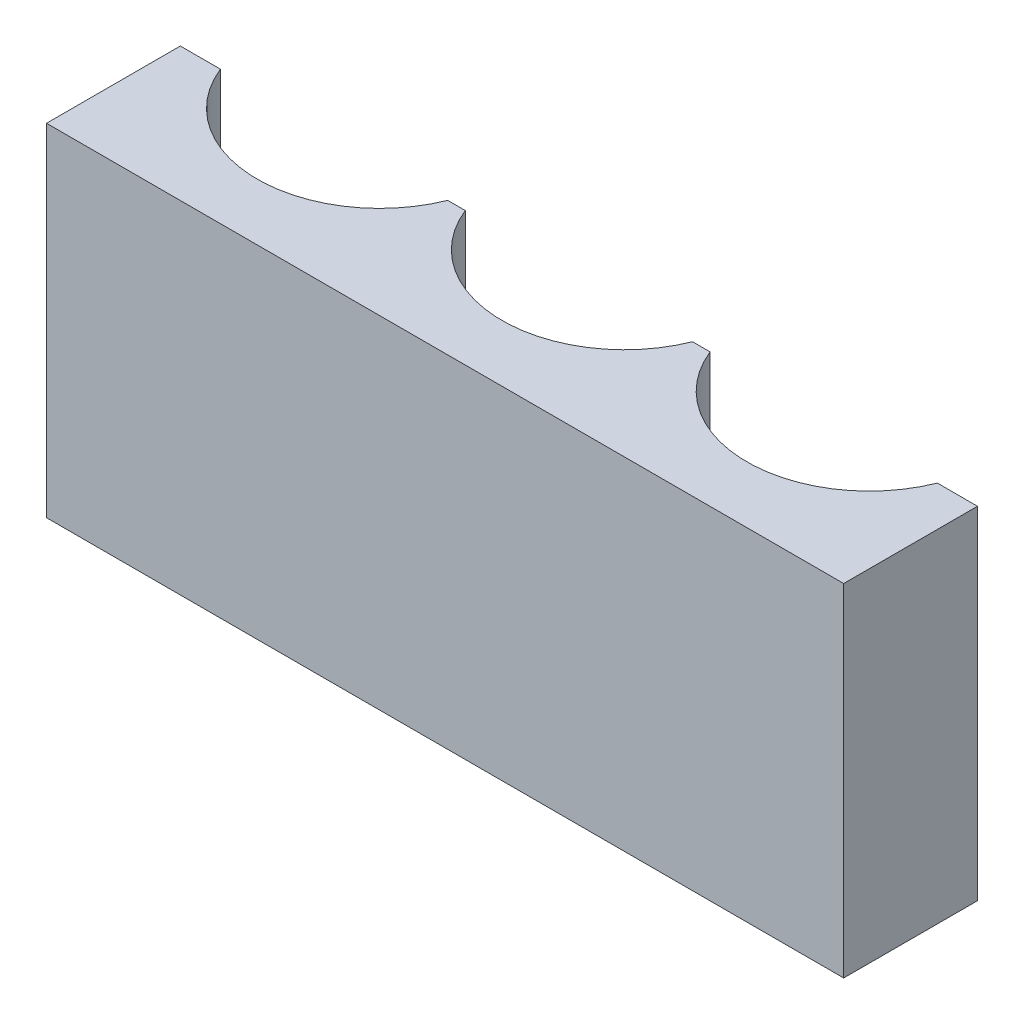
ISO-10303-21;
HEADER;
FILE_DESCRIPTION(('STEP AP214'),'2;1');
FILE_NAME('part.step','',(''),(''),'','','');
FILE_SCHEMA(('AUTOMOTIVE_DESIGN { 1 0 10303 214 1 1 1 1 }'));
ENDSEC;
DATA;
#1=APPLICATION_CONTEXT('core data for automotive mechanical design processes');
#2=APPLICATION_PROTOCOL_DEFINITION('international standard','automotive_design',2000,#1);
#3=PRODUCT_CONTEXT('',#1,'mechanical');
#4=PRODUCT('Part','Part','',(#3));
#5=PRODUCT_RELATED_PRODUCT_CATEGORY('part','',(#4));
#6=PRODUCT_DEFINITION_FORMATION('','',#4);
#7=PRODUCT_DEFINITION_CONTEXT('part definition',#1,'design');
#8=PRODUCT_DEFINITION('design','',#6,#7);
#9=PRODUCT_DEFINITION_SHAPE('','',#8);
#10=(LENGTH_UNIT() NAMED_UNIT(*) SI_UNIT(.MILLI.,.METRE.));
#11=(NAMED_UNIT(*) PLANE_ANGLE_UNIT() SI_UNIT($,.RADIAN.));
#12=(NAMED_UNIT(*) SI_UNIT($,.STERADIAN.) SOLID_ANGLE_UNIT());
#13=UNCERTAINTY_MEASURE_WITH_UNIT(LENGTH_MEASURE(1.E-05),#10,'distance_accuracy_value','');
#14=(GEOMETRIC_REPRESENTATION_CONTEXT(3) GLOBAL_UNCERTAINTY_ASSIGNED_CONTEXT((#13)) GLOBAL_UNIT_ASSIGNED_CONTEXT((#10,
#11,#12)) REPRESENTATION_CONTEXT('',''));
#15=CARTESIAN_POINT('',(0.,0.,0.));
#16=DIRECTION('',(0.,0.,1.));
#17=DIRECTION('',(1.,0.,0.));
#18=AXIS2_PLACEMENT_3D('',#15,#16,#17);
#19=CARTESIAN_POINT('',(-35.,15.,15.75));
#20=DIRECTION('',(0.,-1.,0.));
#21=DIRECTION('',(0.,0.,-1.));
#22=AXIS2_PLACEMENT_3D('',#19,#20,#21);
#23=PLANE('',#22);
#24=DIRECTION('',(0.,0.,-1.));
#25=VECTOR('',#24,1.);
#26=CARTESIAN_POINT('',(35.,15.,15.75));
#27=LINE('',#26,#25);
#28=CARTESIAN_POINT('',(35.,15.,15.75));
#29=VERTEX_POINT('',#28);
#30=CARTESIAN_POINT('',(35.,15.,4.));
#31=VERTEX_POINT('',#30);
#32=EDGE_CURVE('E346',#29,#31,#27,.T.);
#33=ORIENTED_EDGE('',*,*,#32,.T.);
#34=DIRECTION('',(1.,0.,0.));
#35=VECTOR('',#34,1.);
#36=CARTESIAN_POINT('',(-35.,15.,4.));
#37=LINE('',#36,#35);
#38=CARTESIAN_POINT('',(31.4781010217376,15.,4.));
#39=VERTEX_POINT('',#38);
#40=EDGE_CURVE('E243',#39,#31,#37,.T.);
#41=ORIENTED_EDGE('',*,*,#40,.F.);
#42=CARTESIAN_POINT('',(21.5,15.,0.));
#43=DIRECTION('',(0.,1.,0.));
#44=DIRECTION('',(0.,0.,1.));
#45=AXIS2_PLACEMENT_3D('',#42,#43,#44);
#46=CIRCLE('',#45,10.75);
#47=CARTESIAN_POINT('',(11.5218989782624,15.,4.));
#48=VERTEX_POINT('',#47);
#49=EDGE_CURVE('E314',#39,#48,#46,.F.);
#50=ORIENTED_EDGE('',*,*,#49,.T.);
#51=CARTESIAN_POINT('',(9.97810102173755,15.,4.));
#52=VERTEX_POINT('',#51);
#53=EDGE_CURVE('E453',#52,#48,#37,.T.);
#54=ORIENTED_EDGE('',*,*,#53,.F.);
#55=CARTESIAN_POINT('',(0.,15.,0.));
#56=DIRECTION('',(0.,1.,0.));
#57=DIRECTION('',(0.,0.,1.));
#58=AXIS2_PLACEMENT_3D('',#55,#56,#57);
#59=CIRCLE('',#58,10.75);
#60=CARTESIAN_POINT('',(-9.97810102173755,15.,4.));
#61=VERTEX_POINT('',#60);
#62=EDGE_CURVE('E310',#52,#61,#59,.F.);
#63=ORIENTED_EDGE('',*,*,#62,.T.);
#64=CARTESIAN_POINT('',(-11.5218989782624,15.,4.));
#65=VERTEX_POINT('',#64);
#66=EDGE_CURVE('E297',#65,#61,#37,.T.);
#67=ORIENTED_EDGE('',*,*,#66,.F.);
#68=CARTESIAN_POINT('',(-21.5,15.,1.50133697570255E-13));
#69=DIRECTION('',(0.,1.,0.));
#70=DIRECTION('',(0.,0.,1.));
#71=AXIS2_PLACEMENT_3D('',#68,#69,#70);
#72=CIRCLE('',#71,10.75);
#73=CARTESIAN_POINT('',(-31.4781010217376,15.,4.));
#74=VERTEX_POINT('',#73);
#75=EDGE_CURVE('E321',#65,#74,#72,.F.);
#76=ORIENTED_EDGE('',*,*,#75,.T.);
#77=CARTESIAN_POINT('',(-35.,15.,4.));
#78=VERTEX_POINT('',#77);
#79=EDGE_CURVE('E295',#78,#74,#37,.T.);
#80=ORIENTED_EDGE('',*,*,#79,.F.);
#81=DIRECTION('',(0.,0.,-1.));
#82=VECTOR('',#81,1.);
#83=CARTESIAN_POINT('',(-35.,15.,15.75));
#84=LINE('',#83,#82);
#85=CARTESIAN_POINT('',(-35.,15.,15.75));
#86=VERTEX_POINT('',#85);
#87=EDGE_CURVE('E343',#86,#78,#84,.T.);
#88=ORIENTED_EDGE('',*,*,#87,.F.);
#89=DIRECTION('',(-1.,0.,0.));
#90=VECTOR('',#89,1.);
#91=CARTESIAN_POINT('',(-35.,15.,15.75));
#92=LINE('',#91,#90);
#93=EDGE_CURVE('E331',#29,#86,#92,.T.);
#94=ORIENTED_EDGE('',*,*,#93,.F.);
#95=EDGE_LOOP('',(#33,#41,#50,#54,#63,#67,#76,#80,#88,#94));
#96=FACE_BOUND('',#95,.T.);
#97=ADVANCED_FACE('F64',(#96),#23,.F.);
#98=CARTESIAN_POINT('',(-35.,-15.,15.75));
#99=DIRECTION('',(0.,1.,0.));
#100=DIRECTION('',(0.,0.,1.));
#101=AXIS2_PLACEMENT_3D('',#98,#99,#100);
#102=PLANE('',#101);
#103=DIRECTION('',(0.,0.,-1.));
#104=VECTOR('',#103,1.);
#105=CARTESIAN_POINT('',(-35.,-15.,15.75));
#106=LINE('',#105,#104);
#107=CARTESIAN_POINT('',(-35.,-15.,15.75));
#108=VERTEX_POINT('',#107);
#109=CARTESIAN_POINT('',(-35.,-15.,4.));
#110=VERTEX_POINT('',#109);
#111=EDGE_CURVE('E340',#108,#110,#106,.T.);
#112=ORIENTED_EDGE('',*,*,#111,.T.);
#113=DIRECTION('',(1.,0.,0.));
#114=VECTOR('',#113,1.);
#115=CARTESIAN_POINT('',(-35.,-15.,4.));
#116=LINE('',#115,#114);
#117=CARTESIAN_POINT('',(-31.4781010217376,-15.,4.));
#118=VERTEX_POINT('',#117);
#119=EDGE_CURVE('E289',#110,#118,#116,.T.);
#120=ORIENTED_EDGE('',*,*,#119,.T.);
#121=CARTESIAN_POINT('',(-21.5,-15.,1.50133697570255E-13));
#122=DIRECTION('',(0.,1.,0.));
#123=DIRECTION('',(0.,0.,1.));
#124=AXIS2_PLACEMENT_3D('',#121,#122,#123);
#125=CIRCLE('',#124,10.75);
#126=CARTESIAN_POINT('',(-11.5218989782624,-15.,4.));
#127=VERTEX_POINT('',#126);
#128=EDGE_CURVE('E317',#127,#118,#125,.F.);
#129=ORIENTED_EDGE('',*,*,#128,.F.);
#130=CARTESIAN_POINT('',(-9.97810102173755,-15.,4.));
#131=VERTEX_POINT('',#130);
#132=EDGE_CURVE('E293',#127,#131,#116,.T.);
#133=ORIENTED_EDGE('',*,*,#132,.T.);
#134=CARTESIAN_POINT('',(0.,-15.,0.));
#135=DIRECTION('',(0.,1.,0.));
#136=DIRECTION('',(0.,0.,1.));
#137=AXIS2_PLACEMENT_3D('',#134,#135,#136);
#138=CIRCLE('',#137,10.75);
#139=CARTESIAN_POINT('',(9.97810102173755,-15.,4.));
#140=VERTEX_POINT('',#139);
#141=EDGE_CURVE('E311',#140,#131,#138,.F.);
#142=ORIENTED_EDGE('',*,*,#141,.F.);
#143=CARTESIAN_POINT('',(11.5218989782624,-15.,4.));
#144=VERTEX_POINT('',#143);
#145=EDGE_CURVE('E467',#140,#144,#116,.T.);
#146=ORIENTED_EDGE('',*,*,#145,.T.);
#147=CARTESIAN_POINT('',(21.5,-15.,0.));
#148=DIRECTION('',(0.,1.,0.));
#149=DIRECTION('',(0.,0.,1.));
#150=AXIS2_PLACEMENT_3D('',#147,#148,#149);
#151=CIRCLE('',#150,10.75);
#152=CARTESIAN_POINT('',(31.4781010217376,-15.,4.));
#153=VERTEX_POINT('',#152);
#154=EDGE_CURVE('E324',#153,#144,#151,.F.);
#155=ORIENTED_EDGE('',*,*,#154,.F.);
#156=CARTESIAN_POINT('',(35.,-15.,4.));
#157=VERTEX_POINT('',#156);
#158=EDGE_CURVE('E294',#153,#157,#116,.T.);
#159=ORIENTED_EDGE('',*,*,#158,.T.);
#160=DIRECTION('',(0.,0.,-1.));
#161=VECTOR('',#160,1.);
#162=CARTESIAN_POINT('',(35.,-15.,15.75));
#163=LINE('',#162,#161);
#164=CARTESIAN_POINT('',(35.,-15.,15.75));
#165=VERTEX_POINT('',#164);
#166=EDGE_CURVE('E337',#165,#157,#163,.T.);
#167=ORIENTED_EDGE('',*,*,#166,.F.);
#168=DIRECTION('',(1.,0.,0.));
#169=VECTOR('',#168,1.);
#170=CARTESIAN_POINT('',(-35.,-15.,15.75));
#171=LINE('',#170,#169);
#172=EDGE_CURVE('E335',#108,#165,#171,.T.);
#173=ORIENTED_EDGE('',*,*,#172,.F.);
#174=EDGE_LOOP('',(#112,#120,#129,#133,#142,#146,#155,#159,#167,#173));
#175=FACE_BOUND('',#174,.T.);
#176=ADVANCED_FACE('F400',(#175),#102,.F.);
#177=CARTESIAN_POINT('',(35.,15.,15.75));
#178=DIRECTION('',(-1.,0.,0.));
#179=DIRECTION('',(0.,0.,1.));
#180=AXIS2_PLACEMENT_3D('',#177,#178,#179);
#181=PLANE('',#180);
#182=ORIENTED_EDGE('',*,*,#166,.T.);
#183=DIRECTION('',(0.,1.,0.));
#184=VECTOR('',#183,1.);
#185=CARTESIAN_POINT('',(35.,-15.,4.));
#186=LINE('',#185,#184);
#187=EDGE_CURVE('E298',#157,#31,#186,.T.);
#188=ORIENTED_EDGE('',*,*,#187,.T.);
#189=ORIENTED_EDGE('',*,*,#32,.F.);
#190=DIRECTION('',(0.,1.,0.));
#191=VECTOR('',#190,1.);
#192=CARTESIAN_POINT('',(35.,15.,15.75));
#193=LINE('',#192,#191);
#194=EDGE_CURVE('E320',#165,#29,#193,.T.);
#195=ORIENTED_EDGE('',*,*,#194,.F.);
#196=EDGE_LOOP('',(#182,#188,#189,#195));
#197=FACE_BOUND('',#196,.T.);
#198=ADVANCED_FACE('F66',(#197),#181,.F.);
#199=CARTESIAN_POINT('',(-35.,15.,15.75));
#200=DIRECTION('',(1.,0.,0.));
#201=DIRECTION('',(0.,0.,-1.));
#202=AXIS2_PLACEMENT_3D('',#199,#200,#201);
#203=PLANE('',#202);
#204=ORIENTED_EDGE('',*,*,#87,.T.);
#205=DIRECTION('',(0.,1.,0.));
#206=VECTOR('',#205,1.);
#207=CARTESIAN_POINT('',(-35.,-15.,4.));
#208=LINE('',#207,#206);
#209=EDGE_CURVE('E292',#110,#78,#208,.T.);
#210=ORIENTED_EDGE('',*,*,#209,.F.);
#211=ORIENTED_EDGE('',*,*,#111,.F.);
#212=DIRECTION('',(0.,-1.,0.));
#213=VECTOR('',#212,1.);
#214=CARTESIAN_POINT('',(-35.,15.,15.75));
#215=LINE('',#214,#213);
#216=EDGE_CURVE('E333',#86,#108,#215,.T.);
#217=ORIENTED_EDGE('',*,*,#216,.F.);
#218=EDGE_LOOP('',(#204,#210,#211,#217));
#219=FACE_BOUND('',#218,.T.);
#220=ADVANCED_FACE('F408',(#219),#203,.F.);
#221=CARTESIAN_POINT('',(0.,0.,15.75));
#222=DIRECTION('',(0.,0.,1.));
#223=DIRECTION('',(1.,0.,0.));
#224=AXIS2_PLACEMENT_3D('',#221,#222,#223);
#225=PLANE('',#224);
#226=ORIENTED_EDGE('',*,*,#194,.T.);
#227=ORIENTED_EDGE('',*,*,#93,.T.);
#228=ORIENTED_EDGE('',*,*,#216,.T.);
#229=ORIENTED_EDGE('',*,*,#172,.T.);
#230=EDGE_LOOP('',(#226,#227,#228,#229));
#231=FACE_BOUND('',#230,.T.);
#232=ADVANCED_FACE('F410',(#231),#225,.T.);
#233=CARTESIAN_POINT('',(21.5,-15.,0.));
#234=DIRECTION('',(0.,1.,0.));
#235=DIRECTION('',(0.,0.,1.));
#236=AXIS2_PLACEMENT_3D('',#233,#234,#235);
#237=CYLINDRICAL_SURFACE('',#236,10.75);
#238=CARTESIAN_POINT('',(21.5,-5.00000000000015,0.));
#239=DIRECTION('',(0.,-1.,0.));
#240=DIRECTION('',(0.,0.,-1.));
#241=AXIS2_PLACEMENT_3D('',#238,#239,#240);
#242=CIRCLE('',#241,10.75);
#243=CARTESIAN_POINT('',(24.,-5.00000000000015,10.4552618331632));
#244=VERTEX_POINT('',#243);
#245=CARTESIAN_POINT('',(19.,-5.00000000000015,10.4552618331632));
#246=VERTEX_POINT('',#245);
#247=EDGE_CURVE('E12',#244,#246,#242,.T.);
#248=ORIENTED_EDGE('',*,*,#247,.F.);
#249=DIRECTION('',(0.,1.,0.));
#250=VECTOR('',#249,1.);
#251=CARTESIAN_POINT('',(24.,-15.,10.4552618331632));
#252=LINE('',#251,#250);
#253=CARTESIAN_POINT('',(24.,4.99999999999985,10.4552618331632));
#254=VERTEX_POINT('',#253);
#255=EDGE_CURVE('E72',#254,#244,#252,.F.);
#256=ORIENTED_EDGE('',*,*,#255,.F.);
#257=CARTESIAN_POINT('',(21.5,4.99999999999985,0.));
#258=DIRECTION('',(0.,1.,0.));
#259=DIRECTION('',(0.,0.,1.));
#260=AXIS2_PLACEMENT_3D('',#257,#258,#259);
#261=CIRCLE('',#260,10.75);
#262=CARTESIAN_POINT('',(19.,4.99999999999985,10.4552618331632));
#263=VERTEX_POINT('',#262);
#264=EDGE_CURVE('E371',#263,#254,#261,.T.);
#265=ORIENTED_EDGE('',*,*,#264,.F.);
#266=DIRECTION('',(0.,1.,0.));
#267=VECTOR('',#266,1.);
#268=CARTESIAN_POINT('',(19.,-15.,10.4552618331632));
#269=LINE('',#268,#267);
#270=EDGE_CURVE('E369',#246,#263,#269,.T.);
#271=ORIENTED_EDGE('',*,*,#270,.F.);
#272=EDGE_LOOP('',(#248,#256,#265,#271));
#273=FACE_BOUND('',#272,.T.);
#274=DIRECTION('',(0.,1.,0.));
#275=VECTOR('',#274,1.);
#276=CARTESIAN_POINT('',(31.4781010217376,-15.,4.));
#277=LINE('',#276,#275);
#278=EDGE_CURVE('E308',#153,#39,#277,.T.);
#279=ORIENTED_EDGE('',*,*,#278,.F.);
#280=ORIENTED_EDGE('',*,*,#154,.T.);
#281=DIRECTION('',(0.,1.,0.));
#282=VECTOR('',#281,1.);
#283=CARTESIAN_POINT('',(11.5218989782624,-15.,4.));
#284=LINE('',#283,#282);
#285=EDGE_CURVE('E306',#48,#144,#284,.F.);
#286=ORIENTED_EDGE('',*,*,#285,.F.);
#287=ORIENTED_EDGE('',*,*,#49,.F.);
#288=EDGE_LOOP('',(#279,#280,#286,#287));
#289=FACE_BOUND('',#288,.T.);
#290=ADVANCED_FACE('F383',(#273,#289),#237,.F.);
#291=CARTESIAN_POINT('',(-21.5,-15.,1.50133697570255E-13));
#292=DIRECTION('',(0.,1.,0.));
#293=DIRECTION('',(0.,0.,1.));
#294=AXIS2_PLACEMENT_3D('',#291,#292,#293);
#295=CYLINDRICAL_SURFACE('',#294,10.75);
#296=CARTESIAN_POINT('',(-21.5,-5.,1.50133697570255E-13));
#297=DIRECTION('',(0.,-1.,0.));
#298=DIRECTION('',(0.,0.,-1.));
#299=AXIS2_PLACEMENT_3D('',#296,#297,#298);
#300=CIRCLE('',#299,10.75);
#301=CARTESIAN_POINT('',(-19.,-5.,10.4552618331634));
#302=VERTEX_POINT('',#301);
#303=CARTESIAN_POINT('',(-24.,-5.,10.4552618331634));
#304=VERTEX_POINT('',#303);
#305=EDGE_CURVE('E217',#302,#304,#300,.T.);
#306=ORIENTED_EDGE('',*,*,#305,.F.);
#307=DIRECTION('',(0.,1.,0.));
#308=VECTOR('',#307,1.);
#309=CARTESIAN_POINT('',(-19.,-15.,10.4552618331634));
#310=LINE('',#309,#308);
#311=CARTESIAN_POINT('',(-19.,5.,10.4552618331634));
#312=VERTEX_POINT('',#311);
#313=EDGE_CURVE('E366',#312,#302,#310,.F.);
#314=ORIENTED_EDGE('',*,*,#313,.F.);
#315=CARTESIAN_POINT('',(-21.5,5.,1.50133697570255E-13));
#316=DIRECTION('',(0.,1.,0.));
#317=DIRECTION('',(0.,0.,1.));
#318=AXIS2_PLACEMENT_3D('',#315,#316,#317);
#319=CIRCLE('',#318,10.75);
#320=CARTESIAN_POINT('',(-24.,5.,10.4552618331634));
#321=VERTEX_POINT('',#320);
#322=EDGE_CURVE('E364',#321,#312,#319,.T.);
#323=ORIENTED_EDGE('',*,*,#322,.F.);
#324=DIRECTION('',(0.,1.,0.));
#325=VECTOR('',#324,1.);
#326=CARTESIAN_POINT('',(-24.,-15.,10.4552618331634));
#327=LINE('',#326,#325);
#328=EDGE_CURVE('E362',#304,#321,#327,.T.);
#329=ORIENTED_EDGE('',*,*,#328,.F.);
#330=EDGE_LOOP('',(#306,#314,#323,#329));
#331=FACE_BOUND('',#330,.T.);
#332=DIRECTION('',(0.,1.,0.));
#333=VECTOR('',#332,1.);
#334=CARTESIAN_POINT('',(-11.5218989782624,-15.,4.));
#335=LINE('',#334,#333);
#336=EDGE_CURVE('E304',#127,#65,#335,.T.);
#337=ORIENTED_EDGE('',*,*,#336,.F.);
#338=ORIENTED_EDGE('',*,*,#128,.T.);
#339=DIRECTION('',(0.,1.,0.));
#340=VECTOR('',#339,1.);
#341=CARTESIAN_POINT('',(-31.4781010217376,-15.,4.));
#342=LINE('',#341,#340);
#343=EDGE_CURVE('E301',#74,#118,#342,.F.);
#344=ORIENTED_EDGE('',*,*,#343,.F.);
#345=ORIENTED_EDGE('',*,*,#75,.F.);
#346=EDGE_LOOP('',(#337,#338,#344,#345));
#347=FACE_BOUND('',#346,.T.);
#348=ADVANCED_FACE('F418',(#331,#347),#295,.F.);
#349=CARTESIAN_POINT('',(0.,-15.,0.));
#350=DIRECTION('',(0.,1.,0.));
#351=DIRECTION('',(0.,0.,1.));
#352=AXIS2_PLACEMENT_3D('',#349,#350,#351);
#353=CYLINDRICAL_SURFACE('',#352,10.75);
#354=DIRECTION('',(0.,1.,0.));
#355=VECTOR('',#354,1.);
#356=CARTESIAN_POINT('',(-2.5,-15.,10.4552618331632));
#357=LINE('',#356,#355);
#358=CARTESIAN_POINT('',(-2.5,-5.,10.4552618331632));
#359=VERTEX_POINT('',#358);
#360=CARTESIAN_POINT('',(-2.5,5.,10.4552618331632));
#361=VERTEX_POINT('',#360);
#362=EDGE_CURVE('E359',#359,#361,#357,.T.);
#363=ORIENTED_EDGE('',*,*,#362,.F.);
#364=CARTESIAN_POINT('',(0.,-5.,0.));
#365=DIRECTION('',(0.,-1.,0.));
#366=DIRECTION('',(0.,0.,-1.));
#367=AXIS2_PLACEMENT_3D('',#364,#365,#366);
#368=CIRCLE('',#367,10.75);
#369=CARTESIAN_POINT('',(2.5,-5.,10.4552618331632));
#370=VERTEX_POINT('',#369);
#371=EDGE_CURVE('E357',#370,#359,#368,.T.);
#372=ORIENTED_EDGE('',*,*,#371,.F.);
#373=DIRECTION('',(0.,1.,0.));
#374=VECTOR('',#373,1.);
#375=CARTESIAN_POINT('',(2.5,-15.,10.4552618331632));
#376=LINE('',#375,#374);
#377=CARTESIAN_POINT('',(2.5,5.,10.4552618331632));
#378=VERTEX_POINT('',#377);
#379=EDGE_CURVE('E355',#378,#370,#376,.F.);
#380=ORIENTED_EDGE('',*,*,#379,.F.);
#381=CARTESIAN_POINT('',(0.,5.,0.));
#382=DIRECTION('',(0.,1.,0.));
#383=DIRECTION('',(0.,0.,1.));
#384=AXIS2_PLACEMENT_3D('',#381,#382,#383);
#385=CIRCLE('',#384,10.75);
#386=EDGE_CURVE('E353',#361,#378,#385,.T.);
#387=ORIENTED_EDGE('',*,*,#386,.F.);
#388=EDGE_LOOP('',(#363,#372,#380,#387));
#389=FACE_BOUND('',#388,.T.);
#390=DIRECTION('',(0.,1.,0.));
#391=VECTOR('',#390,1.);
#392=CARTESIAN_POINT('',(9.97810102173755,-15.,4.));
#393=LINE('',#392,#391);
#394=EDGE_CURVE('E351',#140,#52,#393,.T.);
#395=ORIENTED_EDGE('',*,*,#394,.F.);
#396=ORIENTED_EDGE('',*,*,#141,.T.);
#397=DIRECTION('',(0.,1.,0.));
#398=VECTOR('',#397,1.);
#399=CARTESIAN_POINT('',(-9.97810102173755,-15.,4.));
#400=LINE('',#399,#398);
#401=EDGE_CURVE('E349',#61,#131,#400,.F.);
#402=ORIENTED_EDGE('',*,*,#401,.F.);
#403=ORIENTED_EDGE('',*,*,#62,.F.);
#404=EDGE_LOOP('',(#395,#396,#402,#403));
#405=FACE_BOUND('',#404,.T.);
#406=ADVANCED_FACE('F421',(#389,#405),#353,.F.);
#407=CARTESIAN_POINT('',(-35.,-15.,4.));
#408=DIRECTION('',(0.,0.,1.));
#409=DIRECTION('',(1.,0.,0.));
#410=AXIS2_PLACEMENT_3D('',#407,#408,#409);
#411=PLANE('',#410);
#412=ORIENTED_EDGE('',*,*,#336,.T.);
#413=ORIENTED_EDGE('',*,*,#66,.T.);
#414=ORIENTED_EDGE('',*,*,#401,.T.);
#415=ORIENTED_EDGE('',*,*,#132,.F.);
#416=EDGE_LOOP('',(#412,#413,#414,#415));
#417=FACE_BOUND('',#416,.T.);
#418=ADVANCED_FACE('F424',(#417),#411,.F.);
#419=ORIENTED_EDGE('',*,*,#285,.T.);
#420=ORIENTED_EDGE('',*,*,#145,.F.);
#421=ORIENTED_EDGE('',*,*,#394,.T.);
#422=ORIENTED_EDGE('',*,*,#53,.T.);
#423=EDGE_LOOP('',(#419,#420,#421,#422));
#424=FACE_BOUND('',#423,.T.);
#425=ADVANCED_FACE('F429',(#424),#411,.F.);
#426=ORIENTED_EDGE('',*,*,#343,.T.);
#427=ORIENTED_EDGE('',*,*,#119,.F.);
#428=ORIENTED_EDGE('',*,*,#209,.T.);
#429=ORIENTED_EDGE('',*,*,#79,.T.);
#430=EDGE_LOOP('',(#426,#427,#428,#429));
#431=FACE_BOUND('',#430,.T.);
#432=ADVANCED_FACE('F426',(#431),#411,.F.);
#433=ORIENTED_EDGE('',*,*,#278,.T.);
#434=ORIENTED_EDGE('',*,*,#40,.T.);
#435=ORIENTED_EDGE('',*,*,#187,.F.);
#436=ORIENTED_EDGE('',*,*,#158,.F.);
#437=EDGE_LOOP('',(#433,#434,#435,#436));
#438=FACE_BOUND('',#437,.T.);
#439=ADVANCED_FACE('F428',(#438),#411,.F.);
#440=CARTESIAN_POINT('',(-2.5,5.,14.));
#441=DIRECTION('',(-1.,0.,0.));
#442=DIRECTION('',(0.,0.,1.));
#443=AXIS2_PLACEMENT_3D('',#440,#441,#442);
#444=PLANE('',#443);
#445=ORIENTED_EDGE('',*,*,#362,.T.);
#446=DIRECTION('',(0.,0.,-1.));
#447=VECTOR('',#446,1.);
#448=CARTESIAN_POINT('',(-2.5,5.,14.));
#449=LINE('',#448,#447);
#450=CARTESIAN_POINT('',(-2.5,5.,14.));
#451=VERTEX_POINT('',#450);
#452=EDGE_CURVE('E248',#451,#361,#449,.T.);
#453=ORIENTED_EDGE('',*,*,#452,.F.);
#454=DIRECTION('',(0.,1.,0.));
#455=VECTOR('',#454,1.);
#456=CARTESIAN_POINT('',(-2.5,5.,14.));
#457=LINE('',#456,#455);
#458=CARTESIAN_POINT('',(-2.5,-5.,14.));
#459=VERTEX_POINT('',#458);
#460=EDGE_CURVE('E233',#459,#451,#457,.T.);
#461=ORIENTED_EDGE('',*,*,#460,.F.);
#462=DIRECTION('',(0.,0.,-1.));
#463=VECTOR('',#462,1.);
#464=CARTESIAN_POINT('',(-2.5,-5.,14.));
#465=LINE('',#464,#463);
#466=EDGE_CURVE('E257',#459,#359,#465,.T.);
#467=ORIENTED_EDGE('',*,*,#466,.T.);
#468=EDGE_LOOP('',(#445,#453,#461,#467));
#469=FACE_BOUND('',#468,.T.);
#470=ADVANCED_FACE('F435',(#469),#444,.F.);
#471=CARTESIAN_POINT('',(2.5,-5.,14.));
#472=DIRECTION('',(0.,-1.,0.));
#473=DIRECTION('',(0.,0.,-1.));
#474=AXIS2_PLACEMENT_3D('',#471,#472,#473);
#475=PLANE('',#474);
#476=ORIENTED_EDGE('',*,*,#371,.T.);
#477=ORIENTED_EDGE('',*,*,#466,.F.);
#478=DIRECTION('',(-1.,0.,0.));
#479=VECTOR('',#478,1.);
#480=CARTESIAN_POINT('',(2.5,-5.,14.));
#481=LINE('',#480,#479);
#482=CARTESIAN_POINT('',(2.5,-5.,14.));
#483=VERTEX_POINT('',#482);
#484=EDGE_CURVE('E250',#483,#459,#481,.T.);
#485=ORIENTED_EDGE('',*,*,#484,.F.);
#486=DIRECTION('',(0.,0.,-1.));
#487=VECTOR('',#486,1.);
#488=CARTESIAN_POINT('',(2.5,-5.,14.));
#489=LINE('',#488,#487);
#490=EDGE_CURVE('E254',#483,#370,#489,.T.);
#491=ORIENTED_EDGE('',*,*,#490,.T.);
#492=EDGE_LOOP('',(#476,#477,#485,#491));
#493=FACE_BOUND('',#492,.T.);
#494=ADVANCED_FACE('F537',(#493),#475,.F.);
#495=CARTESIAN_POINT('',(2.5,5.,14.));
#496=DIRECTION('',(1.,0.,0.));
#497=DIRECTION('',(0.,0.,-1.));
#498=AXIS2_PLACEMENT_3D('',#495,#496,#497);
#499=PLANE('',#498);
#500=ORIENTED_EDGE('',*,*,#379,.T.);
#501=ORIENTED_EDGE('',*,*,#490,.F.);
#502=DIRECTION('',(0.,-1.,0.));
#503=VECTOR('',#502,1.);
#504=CARTESIAN_POINT('',(2.5,5.,14.));
#505=LINE('',#504,#503);
#506=CARTESIAN_POINT('',(2.5,5.,14.));
#507=VERTEX_POINT('',#506);
#508=EDGE_CURVE('E263',#507,#483,#505,.T.);
#509=ORIENTED_EDGE('',*,*,#508,.F.);
#510=DIRECTION('',(0.,0.,-1.));
#511=VECTOR('',#510,1.);
#512=CARTESIAN_POINT('',(2.5,5.,14.));
#513=LINE('',#512,#511);
#514=EDGE_CURVE('E251',#507,#378,#513,.T.);
#515=ORIENTED_EDGE('',*,*,#514,.T.);
#516=EDGE_LOOP('',(#500,#501,#509,#515));
#517=FACE_BOUND('',#516,.T.);
#518=ADVANCED_FACE('F544',(#517),#499,.F.);
#519=CARTESIAN_POINT('',(2.5,5.,14.));
#520=DIRECTION('',(0.,1.,0.));
#521=DIRECTION('',(0.,0.,1.));
#522=AXIS2_PLACEMENT_3D('',#519,#520,#521);
#523=PLANE('',#522);
#524=ORIENTED_EDGE('',*,*,#386,.T.);
#525=ORIENTED_EDGE('',*,*,#514,.F.);
#526=DIRECTION('',(1.,0.,0.));
#527=VECTOR('',#526,1.);
#528=CARTESIAN_POINT('',(2.5,5.,14.));
#529=LINE('',#528,#527);
#530=EDGE_CURVE('E236',#451,#507,#529,.T.);
#531=ORIENTED_EDGE('',*,*,#530,.F.);
#532=ORIENTED_EDGE('',*,*,#452,.T.);
#533=EDGE_LOOP('',(#524,#525,#531,#532));
#534=FACE_BOUND('',#533,.T.);
#535=ADVANCED_FACE('F552',(#534),#523,.F.);
#536=CARTESIAN_POINT('',(0.,0.,14.));
#537=DIRECTION('',(0.,0.,-1.));
#538=DIRECTION('',(-1.,0.,0.));
#539=AXIS2_PLACEMENT_3D('',#536,#537,#538);
#540=PLANE('',#539);
#541=ORIENTED_EDGE('',*,*,#460,.T.);
#542=ORIENTED_EDGE('',*,*,#530,.T.);
#543=ORIENTED_EDGE('',*,*,#508,.T.);
#544=ORIENTED_EDGE('',*,*,#484,.T.);
#545=EDGE_LOOP('',(#541,#542,#543,#544));
#546=FACE_BOUND('',#545,.T.);
#547=ADVANCED_FACE('F560',(#546),#540,.T.);
#548=CARTESIAN_POINT('',(-19.,-5.,14.));
#549=DIRECTION('',(0.,-1.,0.));
#550=DIRECTION('',(0.,0.,-1.));
#551=AXIS2_PLACEMENT_3D('',#548,#549,#550);
#552=PLANE('',#551);
#553=ORIENTED_EDGE('',*,*,#305,.T.);
#554=DIRECTION('',(0.,0.,-1.));
#555=VECTOR('',#554,1.);
#556=CARTESIAN_POINT('',(-24.,-5.,14.));
#557=LINE('',#556,#555);
#558=CARTESIAN_POINT('',(-24.,-5.,14.));
#559=VERTEX_POINT('',#558);
#560=EDGE_CURVE('E86',#559,#304,#557,.T.);
#561=ORIENTED_EDGE('',*,*,#560,.F.);
#562=DIRECTION('',(-1.,0.,0.));
#563=VECTOR('',#562,1.);
#564=CARTESIAN_POINT('',(-19.,-5.,14.));
#565=LINE('',#564,#563);
#566=CARTESIAN_POINT('',(-19.,-5.,14.));
#567=VERTEX_POINT('',#566);
#568=EDGE_CURVE('E214',#567,#559,#565,.T.);
#569=ORIENTED_EDGE('',*,*,#568,.F.);
#570=DIRECTION('',(0.,0.,-1.));
#571=VECTOR('',#570,1.);
#572=CARTESIAN_POINT('',(-19.,-5.,14.));
#573=LINE('',#572,#571);
#574=EDGE_CURVE('E241',#567,#302,#573,.T.);
#575=ORIENTED_EDGE('',*,*,#574,.T.);
#576=EDGE_LOOP('',(#553,#561,#569,#575));
#577=FACE_BOUND('',#576,.T.);
#578=ADVANCED_FACE('F211',(#577),#552,.F.);
#579=CARTESIAN_POINT('',(-19.,5.,14.));
#580=DIRECTION('',(1.,0.,0.));
#581=DIRECTION('',(0.,0.,-1.));
#582=AXIS2_PLACEMENT_3D('',#579,#580,#581);
#583=PLANE('',#582);
#584=ORIENTED_EDGE('',*,*,#313,.T.);
#585=ORIENTED_EDGE('',*,*,#574,.F.);
#586=DIRECTION('',(0.,-1.,0.));
#587=VECTOR('',#586,1.);
#588=CARTESIAN_POINT('',(-19.,5.,14.));
#589=LINE('',#588,#587);
#590=CARTESIAN_POINT('',(-19.,5.,14.));
#591=VERTEX_POINT('',#590);
#592=EDGE_CURVE('E220',#591,#567,#589,.T.);
#593=ORIENTED_EDGE('',*,*,#592,.F.);
#594=DIRECTION('',(0.,0.,-1.));
#595=VECTOR('',#594,1.);
#596=CARTESIAN_POINT('',(-19.,5.,14.));
#597=LINE('',#596,#595);
#598=EDGE_CURVE('E244',#591,#312,#597,.T.);
#599=ORIENTED_EDGE('',*,*,#598,.T.);
#600=EDGE_LOOP('',(#584,#585,#593,#599));
#601=FACE_BOUND('',#600,.T.);
#602=ADVANCED_FACE('F575',(#601),#583,.F.);
#603=CARTESIAN_POINT('',(-19.,5.,14.));
#604=DIRECTION('',(0.,1.,0.));
#605=DIRECTION('',(0.,0.,1.));
#606=AXIS2_PLACEMENT_3D('',#603,#604,#605);
#607=PLANE('',#606);
#608=ORIENTED_EDGE('',*,*,#322,.T.);
#609=ORIENTED_EDGE('',*,*,#598,.F.);
#610=DIRECTION('',(1.,0.,0.));
#611=VECTOR('',#610,1.);
#612=CARTESIAN_POINT('',(-19.,5.,14.));
#613=LINE('',#612,#611);
#614=CARTESIAN_POINT('',(-24.,5.,14.));
#615=VERTEX_POINT('',#614);
#616=EDGE_CURVE('E229',#615,#591,#613,.T.);
#617=ORIENTED_EDGE('',*,*,#616,.F.);
#618=DIRECTION('',(0.,0.,-1.));
#619=VECTOR('',#618,1.);
#620=CARTESIAN_POINT('',(-24.,5.,14.));
#621=LINE('',#620,#619);
#622=EDGE_CURVE('E219',#615,#321,#621,.T.);
#623=ORIENTED_EDGE('',*,*,#622,.T.);
#624=EDGE_LOOP('',(#608,#609,#617,#623));
#625=FACE_BOUND('',#624,.T.);
#626=ADVANCED_FACE('F582',(#625),#607,.F.);
#627=CARTESIAN_POINT('',(-24.,5.,14.));
#628=DIRECTION('',(-1.,0.,0.));
#629=DIRECTION('',(0.,0.,1.));
#630=AXIS2_PLACEMENT_3D('',#627,#628,#629);
#631=PLANE('',#630);
#632=ORIENTED_EDGE('',*,*,#328,.T.);
#633=ORIENTED_EDGE('',*,*,#622,.F.);
#634=DIRECTION('',(0.,1.,0.));
#635=VECTOR('',#634,1.);
#636=CARTESIAN_POINT('',(-24.,5.,14.));
#637=LINE('',#636,#635);
#638=EDGE_CURVE('E223',#559,#615,#637,.T.);
#639=ORIENTED_EDGE('',*,*,#638,.F.);
#640=ORIENTED_EDGE('',*,*,#560,.T.);
#641=EDGE_LOOP('',(#632,#633,#639,#640));
#642=FACE_BOUND('',#641,.T.);
#643=ADVANCED_FACE('F224',(#642),#631,.F.);
#644=CARTESIAN_POINT('',(0.,0.,14.));
#645=DIRECTION('',(0.,0.,1.));
#646=DIRECTION('',(1.,0.,0.));
#647=AXIS2_PLACEMENT_3D('',#644,#645,#646);
#648=PLANE('',#647);
#649=ORIENTED_EDGE('',*,*,#568,.T.);
#650=ORIENTED_EDGE('',*,*,#638,.T.);
#651=ORIENTED_EDGE('',*,*,#616,.T.);
#652=ORIENTED_EDGE('',*,*,#592,.T.);
#653=EDGE_LOOP('',(#649,#650,#651,#652));
#654=FACE_BOUND('',#653,.T.);
#655=ADVANCED_FACE('F231',(#654),#648,.F.);
#656=CARTESIAN_POINT('',(24.,-5.00000000000015,14.));
#657=DIRECTION('',(0.,-1.,0.));
#658=DIRECTION('',(0.,0.,-1.));
#659=AXIS2_PLACEMENT_3D('',#656,#657,#658);
#660=PLANE('',#659);
#661=ORIENTED_EDGE('',*,*,#247,.T.);
#662=DIRECTION('',(0.,0.,-1.));
#663=VECTOR('',#662,1.);
#664=CARTESIAN_POINT('',(19.,-5.00000000000015,14.));
#665=LINE('',#664,#663);
#666=CARTESIAN_POINT('',(19.,-5.00000000000015,14.));
#667=VERTEX_POINT('',#666);
#668=EDGE_CURVE('E79',#667,#246,#665,.T.);
#669=ORIENTED_EDGE('',*,*,#668,.F.);
#670=DIRECTION('',(-1.,0.,0.));
#671=VECTOR('',#670,1.);
#672=CARTESIAN_POINT('',(24.,-5.00000000000015,14.));
#673=LINE('',#672,#671);
#674=CARTESIAN_POINT('',(24.,-5.00000000000015,14.));
#675=VERTEX_POINT('',#674);
#676=EDGE_CURVE('E260',#675,#667,#673,.T.);
#677=ORIENTED_EDGE('',*,*,#676,.F.);
#678=DIRECTION('',(0.,0.,-1.));
#679=VECTOR('',#678,1.);
#680=CARTESIAN_POINT('',(24.,-5.00000000000015,14.));
#681=LINE('',#680,#679);
#682=EDGE_CURVE('E276',#675,#244,#681,.T.);
#683=ORIENTED_EDGE('',*,*,#682,.T.);
#684=EDGE_LOOP('',(#661,#669,#677,#683));
#685=FACE_BOUND('',#684,.T.);
#686=ADVANCED_FACE('F381',(#685),#660,.F.);
#687=CARTESIAN_POINT('',(24.,4.99999999999985,14.));
#688=DIRECTION('',(1.,0.,0.));
#689=DIRECTION('',(0.,0.,-1.));
#690=AXIS2_PLACEMENT_3D('',#687,#688,#689);
#691=PLANE('',#690);
#692=ORIENTED_EDGE('',*,*,#255,.T.);
#693=ORIENTED_EDGE('',*,*,#682,.F.);
#694=DIRECTION('',(0.,-1.,0.));
#695=VECTOR('',#694,1.);
#696=CARTESIAN_POINT('',(24.,4.99999999999985,14.));
#697=LINE('',#696,#695);
#698=CARTESIAN_POINT('',(24.,4.99999999999985,14.));
#699=VERTEX_POINT('',#698);
#700=EDGE_CURVE('E269',#699,#675,#697,.T.);
#701=ORIENTED_EDGE('',*,*,#700,.F.);
#702=DIRECTION('',(0.,0.,-1.));
#703=VECTOR('',#702,1.);
#704=CARTESIAN_POINT('',(24.,4.99999999999985,14.));
#705=LINE('',#704,#703);
#706=EDGE_CURVE('E273',#699,#254,#705,.T.);
#707=ORIENTED_EDGE('',*,*,#706,.T.);
#708=EDGE_LOOP('',(#692,#693,#701,#707));
#709=FACE_BOUND('',#708,.T.);
#710=ADVANCED_FACE('F374',(#709),#691,.F.);
#711=CARTESIAN_POINT('',(24.,4.99999999999985,14.));
#712=DIRECTION('',(0.,1.,0.));
#713=DIRECTION('',(0.,0.,1.));
#714=AXIS2_PLACEMENT_3D('',#711,#712,#713);
#715=PLANE('',#714);
#716=ORIENTED_EDGE('',*,*,#264,.T.);
#717=ORIENTED_EDGE('',*,*,#706,.F.);
#718=DIRECTION('',(1.,0.,0.));
#719=VECTOR('',#718,1.);
#720=CARTESIAN_POINT('',(24.,4.99999999999985,14.));
#721=LINE('',#720,#719);
#722=CARTESIAN_POINT('',(19.,4.99999999999985,14.));
#723=VERTEX_POINT('',#722);
#724=EDGE_CURVE('E281',#723,#699,#721,.T.);
#725=ORIENTED_EDGE('',*,*,#724,.F.);
#726=DIRECTION('',(0.,0.,-1.));
#727=VECTOR('',#726,1.);
#728=CARTESIAN_POINT('',(19.,4.99999999999985,14.));
#729=LINE('',#728,#727);
#730=EDGE_CURVE('E270',#723,#263,#729,.T.);
#731=ORIENTED_EDGE('',*,*,#730,.T.);
#732=EDGE_LOOP('',(#716,#717,#725,#731));
#733=FACE_BOUND('',#732,.T.);
#734=ADVANCED_FACE('F388',(#733),#715,.F.);
#735=CARTESIAN_POINT('',(19.,4.99999999999985,14.));
#736=DIRECTION('',(-1.,0.,0.));
#737=DIRECTION('',(0.,0.,1.));
#738=AXIS2_PLACEMENT_3D('',#735,#736,#737);
#739=PLANE('',#738);
#740=ORIENTED_EDGE('',*,*,#270,.T.);
#741=ORIENTED_EDGE('',*,*,#730,.F.);
#742=DIRECTION('',(0.,1.,0.));
#743=VECTOR('',#742,1.);
#744=CARTESIAN_POINT('',(19.,4.99999999999985,14.));
#745=LINE('',#744,#743);
#746=EDGE_CURVE('E284',#667,#723,#745,.T.);
#747=ORIENTED_EDGE('',*,*,#746,.F.);
#748=ORIENTED_EDGE('',*,*,#668,.T.);
#749=EDGE_LOOP('',(#740,#741,#747,#748));
#750=FACE_BOUND('',#749,.T.);
#751=ADVANCED_FACE('F385',(#750),#739,.F.);
#752=CARTESIAN_POINT('',(0.,0.,14.));
#753=DIRECTION('',(0.,0.,1.));
#754=DIRECTION('',(1.,0.,0.));
#755=AXIS2_PLACEMENT_3D('',#752,#753,#754);
#756=PLANE('',#755);
#757=ORIENTED_EDGE('',*,*,#676,.T.);
#758=ORIENTED_EDGE('',*,*,#746,.T.);
#759=ORIENTED_EDGE('',*,*,#724,.T.);
#760=ORIENTED_EDGE('',*,*,#700,.T.);
#761=EDGE_LOOP('',(#757,#758,#759,#760));
#762=FACE_BOUND('',#761,.T.);
#763=ADVANCED_FACE('F390',(#762),#756,.F.);
#764=CLOSED_SHELL('',(#97,#176,#198,#220,#232,#290,#348,#406,#418,#425,#432,#439,#470,#494,#518,
#535,#547,#578,#602,#626,#643,#655,#686,#710,#734,#751,#763));
#765=MANIFOLD_SOLID_BREP('B2',#764);
#766=ADVANCED_BREP_SHAPE_REPRESENTATION('',(#18,#765),#14);
#767=SHAPE_DEFINITION_REPRESENTATION(#9,#766);
ENDSEC;
END-ISO-10303-21;
